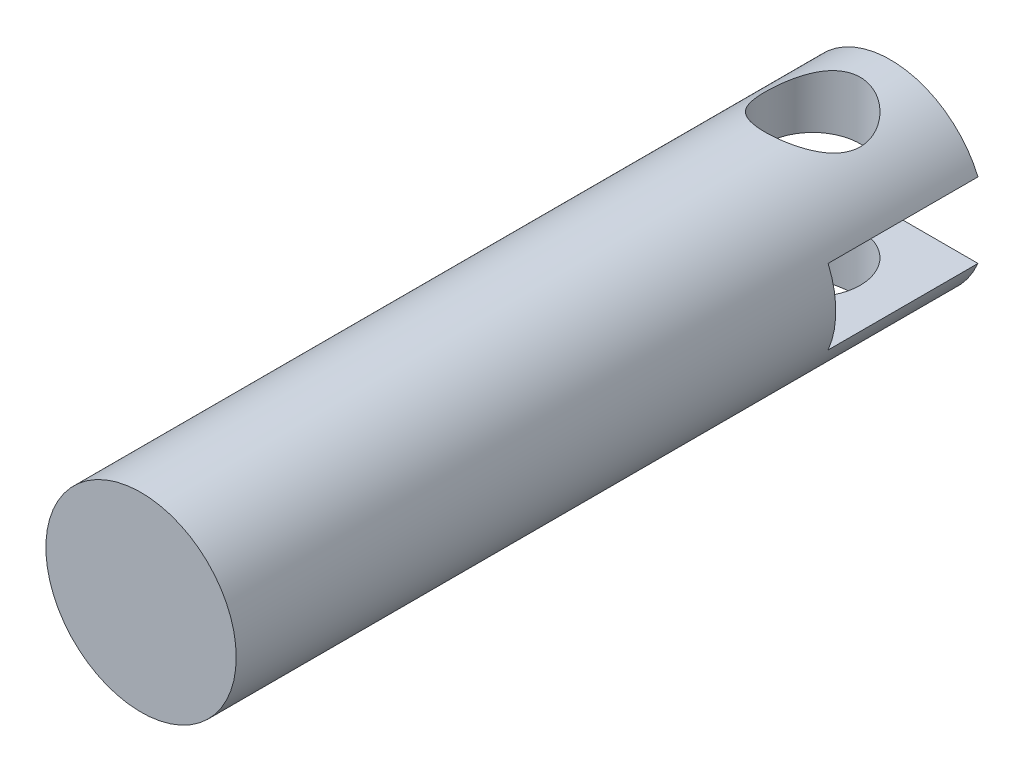
ISO-10303-21;
HEADER;
FILE_DESCRIPTION(('STEP AP214'),'2;1');
FILE_NAME('part.step','',(''),(''),'','','');
FILE_SCHEMA(('AUTOMOTIVE_DESIGN { 1 0 10303 214 1 1 1 1 }'));
ENDSEC;
DATA;
#1=APPLICATION_CONTEXT('core data for automotive mechanical design processes');
#2=APPLICATION_PROTOCOL_DEFINITION('international standard','automotive_design',2000,#1);
#3=PRODUCT_CONTEXT('',#1,'mechanical');
#4=PRODUCT('Part','Part','',(#3));
#5=PRODUCT_RELATED_PRODUCT_CATEGORY('part','',(#4));
#6=PRODUCT_DEFINITION_FORMATION('','',#4);
#7=PRODUCT_DEFINITION_CONTEXT('part definition',#1,'design');
#8=PRODUCT_DEFINITION('design','',#6,#7);
#9=PRODUCT_DEFINITION_SHAPE('','',#8);
#10=(LENGTH_UNIT() NAMED_UNIT(*) SI_UNIT(.MILLI.,.METRE.));
#11=(NAMED_UNIT(*) PLANE_ANGLE_UNIT() SI_UNIT($,.RADIAN.));
#12=(NAMED_UNIT(*) SI_UNIT($,.STERADIAN.) SOLID_ANGLE_UNIT());
#13=UNCERTAINTY_MEASURE_WITH_UNIT(LENGTH_MEASURE(1.E-05),#10,'distance_accuracy_value','');
#14=(GEOMETRIC_REPRESENTATION_CONTEXT(3) GLOBAL_UNCERTAINTY_ASSIGNED_CONTEXT((#13)) GLOBAL_UNIT_ASSIGNED_CONTEXT((#10,
#11,#12)) REPRESENTATION_CONTEXT('',''));
#15=CARTESIAN_POINT('',(0.,0.,0.));
#16=DIRECTION('',(0.,0.,1.));
#17=DIRECTION('',(1.,0.,0.));
#18=AXIS2_PLACEMENT_3D('',#15,#16,#17);
#19=CARTESIAN_POINT('',(0.,0.,0.));
#20=DIRECTION('',(0.,0.,1.));
#21=DIRECTION('',(1.,0.,0.));
#22=AXIS2_PLACEMENT_3D('',#19,#20,#21);
#23=PLANE('',#22);
#24=CARTESIAN_POINT('',(0.,0.,0.));
#25=DIRECTION('',(0.,0.,1.));
#26=DIRECTION('',(1.,0.,0.));
#27=AXIS2_PLACEMENT_3D('',#24,#25,#26);
#28=CIRCLE('',#27,6.35);
#29=CARTESIAN_POINT('',(-5.83716540796986,-2.5,0.));
#30=VERTEX_POINT('',#29);
#31=CARTESIAN_POINT('',(5.83716540796986,-2.5,0.));
#32=VERTEX_POINT('',#31);
#33=EDGE_CURVE('E96',#30,#32,#28,.T.);
#34=ORIENTED_EDGE('',*,*,#33,.F.);
#35=DIRECTION('',(1.,0.,0.));
#36=VECTOR('',#35,1.);
#37=CARTESIAN_POINT('',(0.,-2.5,0.));
#38=LINE('',#37,#36);
#39=EDGE_CURVE('E85',#30,#32,#38,.T.);
#40=ORIENTED_EDGE('',*,*,#39,.T.);
#41=EDGE_LOOP('',(#34,#40));
#42=FACE_BOUND('',#41,.T.);
#43=ADVANCED_FACE('F35',(#42),#23,.F.);
#44=CARTESIAN_POINT('',(0.,0.,50.));
#45=DIRECTION('',(0.,0.,-1.));
#46=DIRECTION('',(-1.,0.,0.));
#47=AXIS2_PLACEMENT_3D('',#44,#45,#46);
#48=CYLINDRICAL_SURFACE('',#47,6.35);
#49=CARTESIAN_POINT('',(0.,-6.35,8.36635609450672));
#50=CARTESIAN_POINT('',(0.0834969220594998,-6.34999931166444,8.36635520678909));
#51=CARTESIAN_POINT('',(0.167002655580042,-6.34834758911701,8.36305622006076));
#52=CARTESIAN_POINT('',(0.333378330258781,-6.34179105821714,8.34991021995682));
#53=CARTESIAN_POINT('',(0.416247978955771,-6.33688483467113,8.34006035798094));
#54=CARTESIAN_POINT('',(0.663182030647009,-6.31742426748325,8.3007840294607));
#55=CARTESIAN_POINT('',(0.825450146761554,-6.29812827299425,8.26163101710532));
#56=CARTESIAN_POINT('',(1.13965128900426,-6.2489182313574,8.15936538321257));
#57=CARTESIAN_POINT('',(1.29162180811869,-6.21904547786825,8.09634587526331));
#58=CARTESIAN_POINT('',(1.58264035037879,-6.15142812041637,7.94862002087782));
#59=CARTESIAN_POINT('',(1.72168939123018,-6.11368413715877,7.86391538435576));
#60=CARTESIAN_POINT('',(1.99234108848171,-6.03111096182982,7.66938646477249));
#61=CARTESIAN_POINT('',(2.12298433900091,-5.98599127270818,7.55835251671278));
#62=CARTESIAN_POINT('',(2.36467069069853,-5.89470535591056,7.31695941093393));
#63=CARTESIAN_POINT('',(2.47569885601321,-5.84853836069043,7.18658566474027));
#64=CARTESIAN_POINT('',(2.68368848497886,-5.75623634934464,6.8979351467534));
#65=CARTESIAN_POINT('',(2.77889135161934,-5.71038146176788,6.73827856320513));
#66=CARTESIAN_POINT('',(2.90019349951534,-5.64919759286363,6.48680810733228));
#67=CARTESIAN_POINT('',(2.93705266116892,-5.63006420805933,6.40095603267804));
#68=CARTESIAN_POINT('',(3.00322508739606,-5.59504604853267,6.22577048080029));
#69=CARTESIAN_POINT('',(3.03254280972159,-5.57915935583429,6.13643909632616));
#70=CARTESIAN_POINT('',(3.08174263292982,-5.55212611635049,5.96034554254197));
#71=CARTESIAN_POINT('',(3.10208128111978,-5.54075429137746,5.87374530047815));
#72=CARTESIAN_POINT('',(3.13545600360765,-5.52193654886444,5.69876881551232));
#73=CARTESIAN_POINT('',(3.14849595237257,-5.51448854851135,5.61039354073501));
#74=CARTESIAN_POINT('',(3.1670771305344,-5.50383875782919,5.4326493556581));
#75=CARTESIAN_POINT('',(3.1726228759965,-5.50063441026522,5.34328107651932));
#76=CARTESIAN_POINT('',(3.17614778806993,-5.49859788398609,5.16437531032863));
#77=CARTESIAN_POINT('',(3.17412767659872,-5.49976528812799,5.07483784023538));
#78=CARTESIAN_POINT('',(3.1581193033026,-5.50899190362732,4.82860821878231));
#79=CARTESIAN_POINT('',(3.13621253452965,-5.52160857357707,4.67251436469335));
#80=CARTESIAN_POINT('',(3.07003746372168,-5.55866493052824,4.36670945320019));
#81=CARTESIAN_POINT('',(3.02576203854504,-5.58310838358077,4.21700044548395));
#82=CARTESIAN_POINT('',(2.91531509833647,-5.64157885407236,3.92381179794257));
#83=CARTESIAN_POINT('',(2.84865758129418,-5.67581583876129,3.78055848457009));
#84=CARTESIAN_POINT('',(2.69570761526054,-5.75003268807633,3.5065900083327));
#85=CARTESIAN_POINT('',(2.60940634674629,-5.79001512927804,3.37588051489821));
#86=CARTESIAN_POINT('',(2.40685964249565,-5.87734289018611,3.11325182025642));
#87=CARTESIAN_POINT('',(2.28820488335253,-5.92497898403936,2.98328070965021));
#88=CARTESIAN_POINT('',(2.03058898448427,-6.01813700574905,2.74427095164287));
#89=CARTESIAN_POINT('',(1.89161819563546,-6.06365791538158,2.63524230814802));
#90=CARTESIAN_POINT('',(1.58913989972483,-6.1500381059768,2.436454174787));
#91=CARTESIAN_POINT('',(1.42479265164789,-6.19058274974572,2.34782460892677));
#92=CARTESIAN_POINT('',(1.08098023585583,-6.25976272299952,2.20019801287137));
#93=CARTESIAN_POINT('',(0.901527205073897,-6.28840750578946,2.14117745337501));
#94=CARTESIAN_POINT('',(0.548533610626835,-6.32854759690358,2.05929669110767));
#95=CARTESIAN_POINT('',(0.375734359385246,-6.34126679122995,2.03384642191938));
#96=CARTESIAN_POINT('',(0.0278752299448324,-6.35231817716325,2.01170557224646));
#97=CARTESIAN_POINT('',(-0.147183538060018,-6.35065718436129,2.01500136736739));
#98=CARTESIAN_POINT('',(-0.480164686080361,-6.33384535408399,2.0487623304521));
#99=CARTESIAN_POINT('',(-0.638363620564189,-6.31975005060431,2.07710188598156));
#100=CARTESIAN_POINT('',(-0.947441883053,-6.28085393924121,2.15681197271661));
#101=CARTESIAN_POINT('',(-1.09832040207141,-6.25605195113515,2.208185042984));
#102=CARTESIAN_POINT('',(-1.39347133182512,-6.19709998236334,2.33385122544451));
#103=CARTESIAN_POINT('',(-1.53743151047822,-6.16270299610718,2.40875767861791));
#104=CARTESIAN_POINT('',(-1.8112148234104,-6.08787118465664,2.57867252019259));
#105=CARTESIAN_POINT('',(-1.94103189959927,-6.0474337895468,2.67368947189212));
#106=CARTESIAN_POINT('',(-2.19636241342679,-5.95973602709939,2.89189544488049));
#107=CARTESIAN_POINT('',(-2.3202013468198,-5.91219559251098,3.01693470161828));
#108=CARTESIAN_POINT('',(-2.54589381918874,-5.81858093231368,3.28611844965647));
#109=CARTESIAN_POINT('',(-2.6477321493525,-5.77250773963547,3.43027604688765));
#110=CARTESIAN_POINT('',(-2.83117262876716,-5.68487535288742,3.74242469646507));
#111=CARTESIAN_POINT('',(-2.91155594998014,-5.64364281441821,3.9112318640171));
#112=CARTESIAN_POINT('',(-3.04191297152939,-5.5744767953732,4.26270055939639));
#113=CARTESIAN_POINT('',(-3.0919258549222,-5.54652618900869,4.4453438923541));
#114=CARTESIAN_POINT('',(-3.15551086037918,-5.51057765714603,4.80054605097688));
#115=CARTESIAN_POINT('',(-3.17212027309711,-5.50092192343245,4.97238984491393));
#116=CARTESIAN_POINT('',(-3.17718805563876,-5.49800001145358,5.31660053700192));
#117=CARTESIAN_POINT('',(-3.16565862768386,-5.50472672904441,5.48896717604935));
#118=CARTESIAN_POINT('',(-3.11761548073658,-5.53205211477784,5.81201619758062));
#119=CARTESIAN_POINT('',(-3.08358651207686,-5.55126823076269,5.96320003623786));
#120=CARTESIAN_POINT('',(-2.99458164828807,-5.59977978302582,6.25754692467389));
#121=CARTESIAN_POINT('',(-2.93959901505999,-5.62907846127335,6.40070737735701));
#122=CARTESIAN_POINT('',(-2.8061154442137,-5.69685576337174,6.68558979393526));
#123=CARTESIAN_POINT('',(-2.72628260503929,-5.73581889480533,6.82656890387238));
#124=CARTESIAN_POINT('',(-2.54682759156583,-5.81772207082382,7.09405352622981));
#125=CARTESIAN_POINT('',(-2.44719512169931,-5.8606641782013,7.22055145444942));
#126=CARTESIAN_POINT('',(-2.21680287661219,-5.95192753761204,7.47145361868377));
#127=CARTESIAN_POINT('',(-2.08373188558712,-6.00026839877346,7.59373585091951));
#128=CARTESIAN_POINT('',(-1.79751265125243,-6.0921234557675,7.81475396773983));
#129=CARTESIAN_POINT('',(-1.64435365457428,-6.13563504323043,7.91347716048944));
#130=CARTESIAN_POINT('',(-1.40178715704487,-6.19391073190243,8.04163636070379));
#131=CARTESIAN_POINT('',(-1.31842200030919,-6.21223173271383,8.08115667818811));
#132=CARTESIAN_POINT('',(-1.14807701021671,-6.24595363475604,8.15295556933041));
#133=CARTESIAN_POINT('',(-1.06109897786306,-6.26135597012704,8.18523770104108));
#134=CARTESIAN_POINT('',(-0.884361322813109,-6.28875097111981,8.24211544042171));
#135=CARTESIAN_POINT('',(-0.794608244970572,-6.30075106809478,8.26672781264483));
#136=CARTESIAN_POINT('',(-0.612925661591582,-6.32100983571903,8.3080234840366));
#137=CARTESIAN_POINT('',(-0.52099752168029,-6.3292707916836,8.32471162670026));
#138=CARTESIAN_POINT('',(-0.357531347524374,-6.34032503263334,8.3469723793691));
#139=CARTESIAN_POINT('',(-0.286274046488594,-6.34394670812889,8.35423491575635));
#140=CARTESIAN_POINT('',(-0.143346668941345,-6.34878452045567,8.36392722104429));
#141=CARTESIAN_POINT('',(-0.071676581091425,-6.35000059089052,8.36635685655354));
#142=CARTESIAN_POINT('',(0.,-6.35,8.36635609450672));
#143=B_SPLINE_CURVE_WITH_KNOTS('',3,(#49,#50,#51,#52,#53,#54,#55,#56,#57,#58,#59,#60,#61,#62,
#63,#64,#65,#66,#67,#68,#69,#70,#71,#72,#73,#74,#75,#76,#77,#78,#79,#80,#81,#82,#83,#84,#85,#86,
#87,#88,#89,#90,#91,#92,#93,#94,#95,#96,#97,#98,#99,#100,#101,#102,#103,#104,#105,#106,#107,
#108,#109,#110,#111,#112,#113,#114,#115,#116,#117,#118,#119,#120,#121,#122,#123,#124,#125,#126,
#127,#128,#129,#130,#131,#132,#133,#134,#135,#136,#137,#138,#139,#140,#141,#142),.UNSPECIFIED.,
.T.,.F.,(4,2,2,2,2,2,2,2,2,2,2,2,2,2,2,2,2,2,2,2,2,2,2,2,2,2,2,2,2,2,2,2,2,2,2,2,2,2,2,2,2,2,2,
2,2,2,4),(0.,0.25041561210268,0.500940186864014,1.00234854488129,1.50182051324263,
2.00125310940106,2.53090025348452,3.06094897410615,3.63210298373098,3.91787290005988,
4.20347350732849,4.47213270490103,4.74064915090148,5.00900371453887,5.27733267302576,
5.74927594687739,6.22136960256846,6.70445970327764,7.18776712794021,7.73235646527881,
8.27720530143646,8.84735553323666,9.41705196489304,9.93956405039339,10.4618285011675,
10.9436138594975,11.4254523397102,11.921067756814,12.4168946391879,12.9614122158798,
13.5063050164601,14.077585736555,14.6481278321882,15.1639000911419,15.6794487286237,
16.1458838633213,16.6124691169503,17.1104020806943,17.6085946442304,18.1673210354482,
18.7263477502427,19.0082017078365,19.2899168101042,19.5710117490933,19.8519346536844,
20.0668939492148,20.2818591776892),.UNSPECIFIED.);
#144=CARTESIAN_POINT('',(0.,-6.35,8.36635609450672));
#145=VERTEX_POINT('',#144);
#146=EDGE_CURVE('E119',#145,#145,#143,.T.);
#147=ORIENTED_EDGE('',*,*,#146,.T.);
#148=EDGE_LOOP('',(#147));
#149=FACE_BOUND('',#148,.T.);
#150=CARTESIAN_POINT('',(0.,6.35,8.36635609450672));
#151=CARTESIAN_POINT('',(-0.0834969220594998,6.34999931166444,8.36635520678909));
#152=CARTESIAN_POINT('',(-0.167002655580042,6.34834758911701,8.36305622006076));
#153=CARTESIAN_POINT('',(-0.333378330258781,6.34179105821714,8.34991021995682));
#154=CARTESIAN_POINT('',(-0.416247978955771,6.33688483467113,8.34006035798094));
#155=CARTESIAN_POINT('',(-0.663182030647009,6.31742426748325,8.3007840294607));
#156=CARTESIAN_POINT('',(-0.825450146761554,6.29812827299425,8.26163101710532));
#157=CARTESIAN_POINT('',(-1.13965128900426,6.2489182313574,8.15936538321257));
#158=CARTESIAN_POINT('',(-1.29162180811868,6.21904547786825,8.09634587526331));
#159=CARTESIAN_POINT('',(-1.58264035037879,6.15142812041637,7.94862002087782));
#160=CARTESIAN_POINT('',(-1.72168939123018,6.11368413715877,7.86391538435576));
#161=CARTESIAN_POINT('',(-1.99234108848171,6.03111096182982,7.66938646477249));
#162=CARTESIAN_POINT('',(-2.12298433900091,5.98599127270818,7.55835251671278));
#163=CARTESIAN_POINT('',(-2.36467069069853,5.89470535591056,7.31695941093393));
#164=CARTESIAN_POINT('',(-2.47569885601321,5.84853836069043,7.18658566474027));
#165=CARTESIAN_POINT('',(-2.68368848497886,5.75623634934464,6.8979351467534));
#166=CARTESIAN_POINT('',(-2.77889135161934,5.71038146176788,6.73827856320513));
#167=CARTESIAN_POINT('',(-2.90019349951534,5.64919759286363,6.48680810733228));
#168=CARTESIAN_POINT('',(-2.93705266116892,5.63006420805933,6.40095603267804));
#169=CARTESIAN_POINT('',(-3.00322508739606,5.59504604853267,6.22577048080029));
#170=CARTESIAN_POINT('',(-3.03254280972159,5.57915935583429,6.13643909632616));
#171=CARTESIAN_POINT('',(-3.08174263292982,5.55212611635049,5.96034554254197));
#172=CARTESIAN_POINT('',(-3.10208128111978,5.54075429137746,5.87374530047815));
#173=CARTESIAN_POINT('',(-3.13545600360765,5.52193654886444,5.69876881551232));
#174=CARTESIAN_POINT('',(-3.14849595237257,5.51448854851135,5.61039354073502));
#175=CARTESIAN_POINT('',(-3.1670771305344,5.50383875782919,5.4326493556581));
#176=CARTESIAN_POINT('',(-3.1726228759965,5.50063441026522,5.34328107651932));
#177=CARTESIAN_POINT('',(-3.17614778806993,5.49859788398609,5.16437531032863));
#178=CARTESIAN_POINT('',(-3.17412767659872,5.49976528812799,5.07483784023538));
#179=CARTESIAN_POINT('',(-3.1581193033026,5.50899190362732,4.82860821878231));
#180=CARTESIAN_POINT('',(-3.13621253452965,5.52160857357707,4.67251436469335));
#181=CARTESIAN_POINT('',(-3.07003746372168,5.55866493052824,4.36670945320019));
#182=CARTESIAN_POINT('',(-3.02576203854504,5.58310838358077,4.21700044548395));
#183=CARTESIAN_POINT('',(-2.91531509833647,5.64157885407237,3.92381179794257));
#184=CARTESIAN_POINT('',(-2.84865758129418,5.67581583876129,3.78055848457009));
#185=CARTESIAN_POINT('',(-2.69570761526054,5.75003268807633,3.5065900083327));
#186=CARTESIAN_POINT('',(-2.60940634674629,5.79001512927804,3.37588051489821));
#187=CARTESIAN_POINT('',(-2.40685964249565,5.87734289018611,3.11325182025642));
#188=CARTESIAN_POINT('',(-2.28820488335253,5.92497898403936,2.98328070965021));
#189=CARTESIAN_POINT('',(-2.03058898448427,6.01813700574905,2.74427095164287));
#190=CARTESIAN_POINT('',(-1.89161819563546,6.06365791538158,2.63524230814802));
#191=CARTESIAN_POINT('',(-1.58913989972483,6.1500381059768,2.436454174787));
#192=CARTESIAN_POINT('',(-1.42479265164789,6.19058274974572,2.34782460892678));
#193=CARTESIAN_POINT('',(-1.08098023585583,6.25976272299952,2.20019801287137));
#194=CARTESIAN_POINT('',(-0.901527205073898,6.28840750578946,2.14117745337501));
#195=CARTESIAN_POINT('',(-0.548533610626835,6.32854759690357,2.05929669110767));
#196=CARTESIAN_POINT('',(-0.375734359385246,6.34126679122995,2.03384642191938));
#197=CARTESIAN_POINT('',(-0.0278752299448329,6.35231817716325,2.01170557224646));
#198=CARTESIAN_POINT('',(0.147183538060017,6.35065718436129,2.01500136736739));
#199=CARTESIAN_POINT('',(0.48016468608036,6.33384535408399,2.0487623304521));
#200=CARTESIAN_POINT('',(0.638363620564188,6.31975005060431,2.07710188598156));
#201=CARTESIAN_POINT('',(0.947441883052999,6.28085393924121,2.15681197271661));
#202=CARTESIAN_POINT('',(1.09832040207141,6.25605195113515,2.208185042984));
#203=CARTESIAN_POINT('',(1.39347133182512,6.19709998236334,2.33385122544451));
#204=CARTESIAN_POINT('',(1.53743151047822,6.16270299610718,2.40875767861791));
#205=CARTESIAN_POINT('',(1.8112148234104,6.08787118465664,2.57867252019259));
#206=CARTESIAN_POINT('',(1.94103189959927,6.0474337895468,2.67368947189212));
#207=CARTESIAN_POINT('',(2.19636241342679,5.95973602709939,2.89189544488049));
#208=CARTESIAN_POINT('',(2.3202013468198,5.91219559251098,3.01693470161828));
#209=CARTESIAN_POINT('',(2.54589381918874,5.81858093231368,3.28611844965647));
#210=CARTESIAN_POINT('',(2.6477321493525,5.77250773963547,3.43027604688765));
#211=CARTESIAN_POINT('',(2.83117262876716,5.68487535288742,3.74242469646507));
#212=CARTESIAN_POINT('',(2.91155594998014,5.64364281441821,3.9112318640171));
#213=CARTESIAN_POINT('',(3.04191297152938,5.5744767953732,4.26270055939639));
#214=CARTESIAN_POINT('',(3.0919258549222,5.54652618900869,4.4453438923541));
#215=CARTESIAN_POINT('',(3.15551086037918,5.51057765714603,4.80054605097688));
#216=CARTESIAN_POINT('',(3.17212027309711,5.50092192343245,4.97238984491393));
#217=CARTESIAN_POINT('',(3.17718805563876,5.49800001145358,5.31660053700192));
#218=CARTESIAN_POINT('',(3.16565862768386,5.50472672904441,5.48896717604935));
#219=CARTESIAN_POINT('',(3.11761548073658,5.53205211477784,5.81201619758062));
#220=CARTESIAN_POINT('',(3.08358651207686,5.55126823076269,5.96320003623786));
#221=CARTESIAN_POINT('',(2.99458164828807,5.59977978302582,6.25754692467389));
#222=CARTESIAN_POINT('',(2.93959901505999,5.62907846127335,6.40070737735701));
#223=CARTESIAN_POINT('',(2.8061154442137,5.69685576337174,6.68558979393526));
#224=CARTESIAN_POINT('',(2.72628260503929,5.73581889480532,6.82656890387238));
#225=CARTESIAN_POINT('',(2.54682759156583,5.81772207082382,7.09405352622981));
#226=CARTESIAN_POINT('',(2.44719512169931,5.8606641782013,7.22055145444942));
#227=CARTESIAN_POINT('',(2.21680287661219,5.95192753761203,7.47145361868377));
#228=CARTESIAN_POINT('',(2.08373188558713,6.00026839877346,7.59373585091951));
#229=CARTESIAN_POINT('',(1.79751265125244,6.0921234557675,7.81475396773983));
#230=CARTESIAN_POINT('',(1.64435365457428,6.13563504323042,7.91347716048943));
#231=CARTESIAN_POINT('',(1.40178715704487,6.19391073190243,8.04163636070378));
#232=CARTESIAN_POINT('',(1.31842200030919,6.21223173271383,8.08115667818811));
#233=CARTESIAN_POINT('',(1.14807701021671,6.24595363475604,8.15295556933041));
#234=CARTESIAN_POINT('',(1.06109897786306,6.26135597012704,8.18523770104108));
#235=CARTESIAN_POINT('',(0.884361322813109,6.28875097111981,8.24211544042171));
#236=CARTESIAN_POINT('',(0.794608244970573,6.30075106809478,8.26672781264483));
#237=CARTESIAN_POINT('',(0.612925661591584,6.32100983571903,8.3080234840366));
#238=CARTESIAN_POINT('',(0.520997521680292,6.3292707916836,8.32471162670026));
#239=CARTESIAN_POINT('',(0.357531347524376,6.34032503263334,8.3469723793691));
#240=CARTESIAN_POINT('',(0.286274046488597,6.34394670812889,8.35423491575635));
#241=CARTESIAN_POINT('',(0.143346668941347,6.34878452045567,8.36392722104429));
#242=CARTESIAN_POINT('',(0.0716765810914259,6.35000059089052,8.36635685655354));
#243=CARTESIAN_POINT('',(0.,6.35,8.36635609450672));
#244=B_SPLINE_CURVE_WITH_KNOTS('',3,(#150,#151,#152,#153,#154,#155,#156,#157,#158,#159,#160,
#161,#162,#163,#164,#165,#166,#167,#168,#169,#170,#171,#172,#173,#174,#175,#176,#177,#178,#179,
#180,#181,#182,#183,#184,#185,#186,#187,#188,#189,#190,#191,#192,#193,#194,#195,#196,#197,#198,
#199,#200,#201,#202,#203,#204,#205,#206,#207,#208,#209,#210,#211,#212,#213,#214,#215,#216,#217,
#218,#219,#220,#221,#222,#223,#224,#225,#226,#227,#228,#229,#230,#231,#232,#233,#234,#235,#236,
#237,#238,#239,#240,#241,#242,#243),.UNSPECIFIED.,.T.,.F.,(4,2,2,2,2,2,2,2,2,2,2,2,2,2,2,2,2,2,
2,2,2,2,2,2,2,2,2,2,2,2,2,2,2,2,2,2,2,2,2,2,2,2,2,2,2,2,4),(0.,0.25041561210268,
0.500940186864014,1.00234854488129,1.50182051324263,2.00125310940106,2.53090025348452,
3.06094897410615,3.63210298373098,3.91787290005988,4.20347350732849,4.47213270490102,
4.74064915090148,5.00900371453887,5.27733267302576,5.74927594687738,6.22136960256846,
6.70445970327764,7.1877671279402,7.7323564652788,8.27720530143645,8.84735553323665,
9.41705196489304,9.93956405039339,10.4618285011675,10.9436138594975,11.4254523397102,
11.9210677568139,12.4168946391879,12.9614122158798,13.5063050164601,14.0775857365549,
14.6481278321882,15.1639000911419,15.6794487286237,16.1458838633213,16.6124691169503,
17.1104020806943,17.6085946442304,18.1673210354482,18.7263477502426,19.0082017078365,
19.2899168101042,19.5710117490933,19.8519346536844,20.0668939492148,20.2818591776892),.UNSPECIFIED.);
#245=CARTESIAN_POINT('',(0.,6.35,8.36635609450672));
#246=VERTEX_POINT('',#245);
#247=EDGE_CURVE('E113',#246,#246,#244,.T.);
#248=ORIENTED_EDGE('',*,*,#247,.T.);
#249=EDGE_LOOP('',(#248));
#250=FACE_BOUND('',#249,.T.);
#251=CARTESIAN_POINT('',(0.,0.,10.));
#252=DIRECTION('',(0.,0.,1.));
#253=DIRECTION('',(1.,0.,0.));
#254=AXIS2_PLACEMENT_3D('',#251,#252,#253);
#255=CIRCLE('',#254,6.35);
#256=CARTESIAN_POINT('',(-5.83716540796987,2.5,10.));
#257=VERTEX_POINT('',#256);
#258=CARTESIAN_POINT('',(-5.83716540796986,-2.5,10.));
#259=VERTEX_POINT('',#258);
#260=EDGE_CURVE('E11',#257,#259,#255,.T.);
#261=ORIENTED_EDGE('',*,*,#260,.T.);
#262=DIRECTION('',(0.,0.,-1.));
#263=VECTOR('',#262,1.);
#264=CARTESIAN_POINT('',(-5.83716540796986,-2.5,50.));
#265=LINE('',#264,#263);
#266=EDGE_CURVE('E60',#259,#30,#265,.T.);
#267=ORIENTED_EDGE('',*,*,#266,.T.);
#268=ORIENTED_EDGE('',*,*,#33,.T.);
#269=DIRECTION('',(0.,0.,-1.));
#270=VECTOR('',#269,1.);
#271=CARTESIAN_POINT('',(5.83716540796986,-2.5,50.));
#272=LINE('',#271,#270);
#273=CARTESIAN_POINT('',(5.83716540796986,-2.5,10.));
#274=VERTEX_POINT('',#273);
#275=EDGE_CURVE('E93',#32,#274,#272,.F.);
#276=ORIENTED_EDGE('',*,*,#275,.T.);
#277=CARTESIAN_POINT('',(5.83716540796987,2.5,10.));
#278=VERTEX_POINT('',#277);
#279=EDGE_CURVE('E45',#274,#278,#255,.T.);
#280=ORIENTED_EDGE('',*,*,#279,.T.);
#281=DIRECTION('',(0.,0.,-1.));
#282=VECTOR('',#281,1.);
#283=CARTESIAN_POINT('',(5.83716540796987,2.5,50.));
#284=LINE('',#283,#282);
#285=CARTESIAN_POINT('',(5.83716540796987,2.5,0.));
#286=VERTEX_POINT('',#285);
#287=EDGE_CURVE('E80',#278,#286,#284,.T.);
#288=ORIENTED_EDGE('',*,*,#287,.T.);
#289=CARTESIAN_POINT('',(-5.83716540796987,2.5,0.));
#290=VERTEX_POINT('',#289);
#291=EDGE_CURVE('E91',#286,#290,#28,.T.);
#292=ORIENTED_EDGE('',*,*,#291,.T.);
#293=DIRECTION('',(0.,0.,-1.));
#294=VECTOR('',#293,1.);
#295=CARTESIAN_POINT('',(-5.83716540796987,2.5,50.));
#296=LINE('',#295,#294);
#297=EDGE_CURVE('E52',#290,#257,#296,.F.);
#298=ORIENTED_EDGE('',*,*,#297,.T.);
#299=EDGE_LOOP('',(#261,#267,#268,#276,#280,#288,#292,#298));
#300=FACE_BOUND('',#299,.T.);
#301=CARTESIAN_POINT('',(0.,0.,50.));
#302=DIRECTION('',(0.,0.,1.));
#303=DIRECTION('',(1.,0.,0.));
#304=AXIS2_PLACEMENT_3D('',#301,#302,#303);
#305=CIRCLE('',#304,6.35);
#306=CARTESIAN_POINT('',(6.35,0.,50.));
#307=VERTEX_POINT('',#306);
#308=EDGE_CURVE('E86',#307,#307,#305,.T.);
#309=ORIENTED_EDGE('',*,*,#308,.F.);
#310=EDGE_LOOP('',(#309));
#311=FACE_BOUND('',#310,.T.);
#312=ADVANCED_FACE('F37',(#149,#250,#300,#311),#48,.T.);
#313=CARTESIAN_POINT('',(0.,0.,50.));
#314=DIRECTION('',(0.,0.,1.));
#315=DIRECTION('',(1.,0.,0.));
#316=AXIS2_PLACEMENT_3D('',#313,#314,#315);
#317=PLANE('',#316);
#318=ORIENTED_EDGE('',*,*,#308,.T.);
#319=EDGE_LOOP('',(#318));
#320=FACE_BOUND('',#319,.T.);
#321=ADVANCED_FACE('F141',(#320),#317,.T.);
#322=ORIENTED_EDGE('',*,*,#291,.F.);
#323=DIRECTION('',(-1.,0.,0.));
#324=VECTOR('',#323,1.);
#325=CARTESIAN_POINT('',(0.,2.5,0.));
#326=LINE('',#325,#324);
#327=EDGE_CURVE('E77',#286,#290,#326,.T.);
#328=ORIENTED_EDGE('',*,*,#327,.T.);
#329=EDGE_LOOP('',(#322,#328));
#330=FACE_BOUND('',#329,.T.);
#331=ADVANCED_FACE('F95',(#330),#23,.F.);
#332=CARTESIAN_POINT('',(0.,0.,10.));
#333=DIRECTION('',(0.,0.,1.));
#334=DIRECTION('',(1.,0.,0.));
#335=AXIS2_PLACEMENT_3D('',#332,#333,#334);
#336=PLANE('',#335);
#337=DIRECTION('',(1.,0.,0.));
#338=VECTOR('',#337,1.);
#339=CARTESIAN_POINT('',(10.8821800051899,2.5,10.));
#340=LINE('',#339,#338);
#341=EDGE_CURVE('E111',#257,#278,#340,.T.);
#342=ORIENTED_EDGE('',*,*,#341,.T.);
#343=ORIENTED_EDGE('',*,*,#279,.F.);
#344=DIRECTION('',(-1.,0.,0.));
#345=VECTOR('',#344,1.);
#346=CARTESIAN_POINT('',(10.8821800051899,-2.5,10.));
#347=LINE('',#346,#345);
#348=EDGE_CURVE('E109',#274,#259,#347,.T.);
#349=ORIENTED_EDGE('',*,*,#348,.T.);
#350=ORIENTED_EDGE('',*,*,#260,.F.);
#351=EDGE_LOOP('',(#342,#343,#349,#350));
#352=FACE_BOUND('',#351,.T.);
#353=ADVANCED_FACE('F129',(#352),#336,.F.);
#354=CARTESIAN_POINT('',(10.8821800051899,-2.5,10.));
#355=DIRECTION('',(0.,-1.,0.));
#356=DIRECTION('',(0.,0.,-1.));
#357=AXIS2_PLACEMENT_3D('',#354,#355,#356);
#358=PLANE('',#357);
#359=CARTESIAN_POINT('',(0.,-2.5,5.19135609450672));
#360=DIRECTION('',(0.,-1.,0.));
#361=DIRECTION('',(0.,0.,-1.));
#362=AXIS2_PLACEMENT_3D('',#359,#360,#361);
#363=CIRCLE('',#362,3.175);
#364=CARTESIAN_POINT('',(0.,-2.5,2.01635609450672));
#365=VERTEX_POINT('',#364);
#366=EDGE_CURVE('E160',#365,#365,#363,.T.);
#367=ORIENTED_EDGE('',*,*,#366,.T.);
#368=EDGE_LOOP('',(#367));
#369=FACE_BOUND('',#368,.T.);
#370=ORIENTED_EDGE('',*,*,#348,.F.);
#371=ORIENTED_EDGE('',*,*,#275,.F.);
#372=ORIENTED_EDGE('',*,*,#39,.F.);
#373=ORIENTED_EDGE('',*,*,#266,.F.);
#374=EDGE_LOOP('',(#370,#371,#372,#373));
#375=FACE_BOUND('',#374,.T.);
#376=ADVANCED_FACE('F133',(#369,#375),#358,.F.);
#377=CARTESIAN_POINT('',(10.8821800051899,2.5,10.));
#378=DIRECTION('',(0.,1.,0.));
#379=DIRECTION('',(0.,0.,1.));
#380=AXIS2_PLACEMENT_3D('',#377,#378,#379);
#381=PLANE('',#380);
#382=CARTESIAN_POINT('',(0.,2.5,5.19135609450672));
#383=DIRECTION('',(0.,1.,0.));
#384=DIRECTION('',(0.,0.,1.));
#385=AXIS2_PLACEMENT_3D('',#382,#383,#384);
#386=CIRCLE('',#385,3.175);
#387=CARTESIAN_POINT('',(0.,2.5,8.36635609450672));
#388=VERTEX_POINT('',#387);
#389=EDGE_CURVE('E40',#388,#388,#386,.T.);
#390=ORIENTED_EDGE('',*,*,#389,.T.);
#391=EDGE_LOOP('',(#390));
#392=FACE_BOUND('',#391,.T.);
#393=ORIENTED_EDGE('',*,*,#341,.F.);
#394=ORIENTED_EDGE('',*,*,#297,.F.);
#395=ORIENTED_EDGE('',*,*,#327,.F.);
#396=ORIENTED_EDGE('',*,*,#287,.F.);
#397=EDGE_LOOP('',(#393,#394,#395,#396));
#398=FACE_BOUND('',#397,.T.);
#399=ADVANCED_FACE('F79',(#392,#398),#381,.F.);
#400=CARTESIAN_POINT('',(0.,-15.5261727578646,5.19135609450672));
#401=DIRECTION('',(0.,1.,0.));
#402=DIRECTION('',(0.,0.,1.));
#403=AXIS2_PLACEMENT_3D('',#400,#401,#402);
#404=CYLINDRICAL_SURFACE('',#403,3.175);
#405=ORIENTED_EDGE('',*,*,#389,.F.);
#406=EDGE_LOOP('',(#405));
#407=FACE_BOUND('',#406,.T.);
#408=ORIENTED_EDGE('',*,*,#247,.F.);
#409=EDGE_LOOP('',(#408));
#410=FACE_BOUND('',#409,.T.);
#411=ADVANCED_FACE('F123',(#407,#410),#404,.F.);
#412=ORIENTED_EDGE('',*,*,#366,.F.);
#413=EDGE_LOOP('',(#412));
#414=FACE_BOUND('',#413,.T.);
#415=ORIENTED_EDGE('',*,*,#146,.F.);
#416=EDGE_LOOP('',(#415));
#417=FACE_BOUND('',#416,.T.);
#418=ADVANCED_FACE('F127',(#414,#417),#404,.F.);
#419=CLOSED_SHELL('',(#43,#312,#321,#331,#353,#376,#399,#411,#418));
#420=MANIFOLD_SOLID_BREP('B2',#419);
#421=ADVANCED_BREP_SHAPE_REPRESENTATION('',(#18,#420),#14);
#422=SHAPE_DEFINITION_REPRESENTATION(#9,#421);
ENDSEC;
END-ISO-10303-21;
